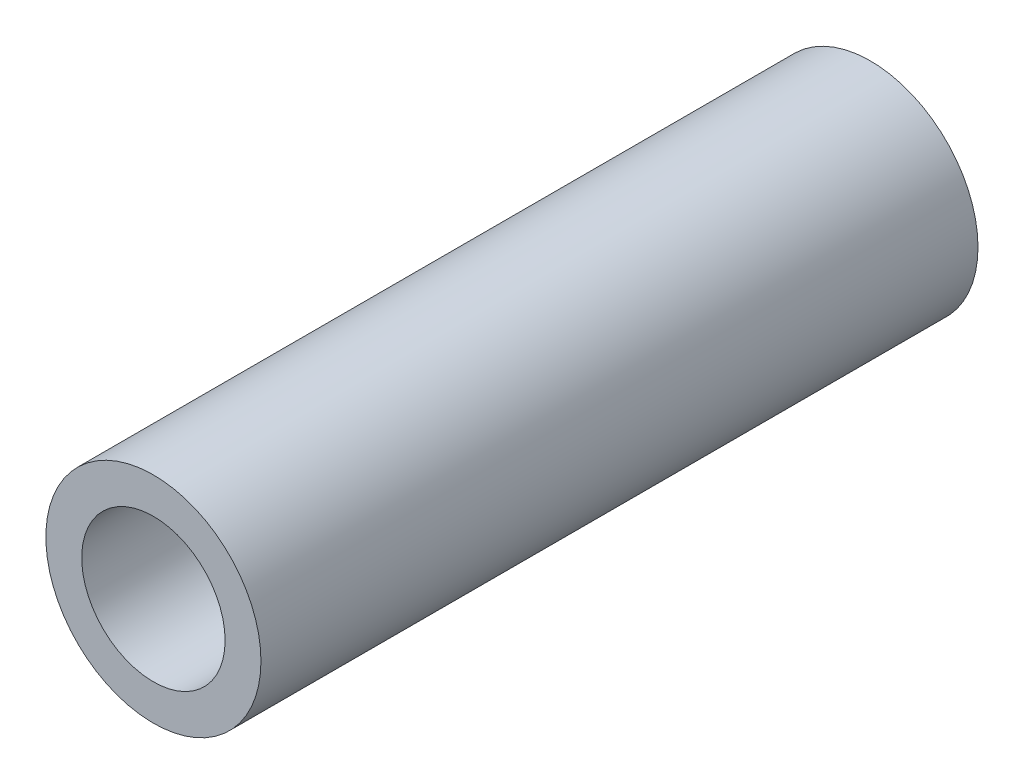
ISO-10303-21;
HEADER;
FILE_DESCRIPTION(('STEP AP214'),'2;1');
FILE_NAME('part.step','',(''),(''),'','','');
FILE_SCHEMA(('AUTOMOTIVE_DESIGN { 1 0 10303 214 1 1 1 1 }'));
ENDSEC;
DATA;
#1=APPLICATION_CONTEXT('core data for automotive mechanical design processes');
#2=APPLICATION_PROTOCOL_DEFINITION('international standard','automotive_design',2000,#1);
#3=PRODUCT_CONTEXT('',#1,'mechanical');
#4=PRODUCT('Part','Part','',(#3));
#5=PRODUCT_RELATED_PRODUCT_CATEGORY('part','',(#4));
#6=PRODUCT_DEFINITION_FORMATION('','',#4);
#7=PRODUCT_DEFINITION_CONTEXT('part definition',#1,'design');
#8=PRODUCT_DEFINITION('design','',#6,#7);
#9=PRODUCT_DEFINITION_SHAPE('','',#8);
#10=(LENGTH_UNIT() NAMED_UNIT(*) SI_UNIT(.MILLI.,.METRE.));
#11=(NAMED_UNIT(*) PLANE_ANGLE_UNIT() SI_UNIT($,.RADIAN.));
#12=(NAMED_UNIT(*) SI_UNIT($,.STERADIAN.) SOLID_ANGLE_UNIT());
#13=UNCERTAINTY_MEASURE_WITH_UNIT(LENGTH_MEASURE(1.E-05),#10,'distance_accuracy_value','');
#14=(GEOMETRIC_REPRESENTATION_CONTEXT(3) GLOBAL_UNCERTAINTY_ASSIGNED_CONTEXT((#13)) GLOBAL_UNIT_ASSIGNED_CONTEXT((#10,
#11,#12)) REPRESENTATION_CONTEXT('',''));
#15=CARTESIAN_POINT('',(0.,0.,0.));
#16=DIRECTION('',(0.,0.,1.));
#17=DIRECTION('',(1.,0.,0.));
#18=AXIS2_PLACEMENT_3D('',#15,#16,#17);
#19=CARTESIAN_POINT('',(0.,0.,0.));
#20=DIRECTION('',(0.,0.,1.));
#21=DIRECTION('',(1.,0.,0.));
#22=AXIS2_PLACEMENT_3D('',#19,#20,#21);
#23=PLANE('',#22);
#24=CARTESIAN_POINT('',(0.,0.,0.));
#25=DIRECTION('',(0.,0.,1.));
#26=DIRECTION('',(1.,0.,0.));
#27=AXIS2_PLACEMENT_3D('',#24,#25,#26);
#28=CIRCLE('',#27,5.);
#29=CARTESIAN_POINT('',(5.,0.,0.));
#30=VERTEX_POINT('',#29);
#31=EDGE_CURVE('E102',#30,#30,#28,.T.);
#32=ORIENTED_EDGE('',*,*,#31,.T.);
#33=EDGE_LOOP('',(#32));
#34=FACE_BOUND('',#33,.T.);
#35=CARTESIAN_POINT('',(0.,0.,0.));
#36=DIRECTION('',(0.,0.,1.));
#37=DIRECTION('',(1.,0.,0.));
#38=AXIS2_PLACEMENT_3D('',#35,#36,#37);
#39=CIRCLE('',#38,7.5);
#40=CARTESIAN_POINT('',(7.5,0.,0.));
#41=VERTEX_POINT('',#40);
#42=EDGE_CURVE('E11',#41,#41,#39,.T.);
#43=ORIENTED_EDGE('',*,*,#42,.F.);
#44=EDGE_LOOP('',(#43));
#45=FACE_BOUND('',#44,.T.);
#46=ADVANCED_FACE('F34',(#34,#45),#23,.F.);
#47=CARTESIAN_POINT('',(0.,0.,50.));
#48=DIRECTION('',(0.,0.,1.));
#49=DIRECTION('',(1.,0.,0.));
#50=AXIS2_PLACEMENT_3D('',#47,#48,#49);
#51=PLANE('',#50);
#52=CARTESIAN_POINT('',(0.,0.,50.));
#53=DIRECTION('',(0.,0.,1.));
#54=DIRECTION('',(1.,0.,0.));
#55=AXIS2_PLACEMENT_3D('',#52,#53,#54);
#56=CIRCLE('',#55,5.);
#57=CARTESIAN_POINT('',(5.,0.,50.));
#58=VERTEX_POINT('',#57);
#59=EDGE_CURVE('E38',#58,#58,#56,.F.);
#60=ORIENTED_EDGE('',*,*,#59,.T.);
#61=EDGE_LOOP('',(#60));
#62=FACE_BOUND('',#61,.T.);
#63=CARTESIAN_POINT('',(0.,0.,50.));
#64=DIRECTION('',(0.,0.,1.));
#65=DIRECTION('',(1.,0.,0.));
#66=AXIS2_PLACEMENT_3D('',#63,#64,#65);
#67=CIRCLE('',#66,7.5);
#68=CARTESIAN_POINT('',(7.5,0.,50.));
#69=VERTEX_POINT('',#68);
#70=EDGE_CURVE('E42',#69,#69,#67,.T.);
#71=ORIENTED_EDGE('',*,*,#70,.T.);
#72=EDGE_LOOP('',(#71));
#73=FACE_BOUND('',#72,.T.);
#74=ADVANCED_FACE('F68',(#62,#73),#51,.T.);
#75=CARTESIAN_POINT('',(0.,0.,50.));
#76=DIRECTION('',(0.,0.,-1.));
#77=DIRECTION('',(-1.,0.,0.));
#78=AXIS2_PLACEMENT_3D('',#75,#76,#77);
#79=CYLINDRICAL_SURFACE('',#78,7.5);
#80=ORIENTED_EDGE('',*,*,#42,.T.);
#81=EDGE_LOOP('',(#80));
#82=FACE_BOUND('',#81,.T.);
#83=ORIENTED_EDGE('',*,*,#70,.F.);
#84=EDGE_LOOP('',(#83));
#85=FACE_BOUND('',#84,.T.);
#86=ADVANCED_FACE('F77',(#82,#85),#79,.T.);
#87=CARTESIAN_POINT('',(0.,0.,61.));
#88=DIRECTION('',(0.,0.,-1.));
#89=DIRECTION('',(-1.,0.,0.));
#90=AXIS2_PLACEMENT_3D('',#87,#88,#89);
#91=CYLINDRICAL_SURFACE('',#90,5.);
#92=ORIENTED_EDGE('',*,*,#59,.F.);
#93=EDGE_LOOP('',(#92));
#94=FACE_BOUND('',#93,.T.);
#95=ORIENTED_EDGE('',*,*,#31,.F.);
#96=EDGE_LOOP('',(#95));
#97=FACE_BOUND('',#96,.T.);
#98=ADVANCED_FACE('F79',(#94,#97),#91,.F.);
#99=CLOSED_SHELL('',(#46,#74,#86,#98));
#100=MANIFOLD_SOLID_BREP('B2',#99);
#101=ADVANCED_BREP_SHAPE_REPRESENTATION('',(#18,#100),#14);
#102=SHAPE_DEFINITION_REPRESENTATION(#9,#101);
ENDSEC;
END-ISO-10303-21;
